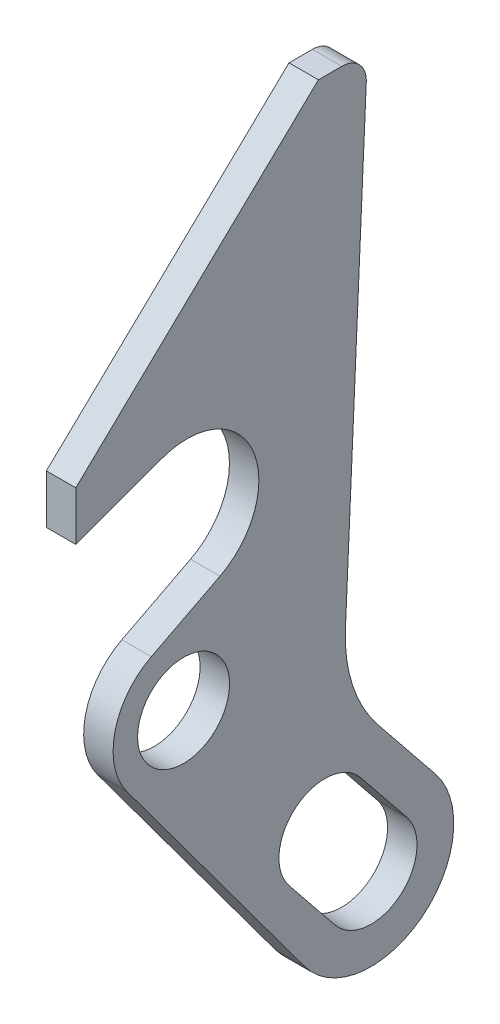
ISO-10303-21;
HEADER;
FILE_DESCRIPTION(('STEP AP214'),'2;1');
FILE_NAME('part.step','',(''),(''),'','','');
FILE_SCHEMA(('AUTOMOTIVE_DESIGN { 1 0 10303 214 1 1 1 1 }'));
ENDSEC;
DATA;
#1=APPLICATION_CONTEXT('core data for automotive mechanical design processes');
#2=APPLICATION_PROTOCOL_DEFINITION('international standard','automotive_design',2000,#1);
#3=PRODUCT_CONTEXT('',#1,'mechanical');
#4=PRODUCT('Part','Part','',(#3));
#5=PRODUCT_RELATED_PRODUCT_CATEGORY('part','',(#4));
#6=PRODUCT_DEFINITION_FORMATION('','',#4);
#7=PRODUCT_DEFINITION_CONTEXT('part definition',#1,'design');
#8=PRODUCT_DEFINITION('design','',#6,#7);
#9=PRODUCT_DEFINITION_SHAPE('','',#8);
#10=(LENGTH_UNIT() NAMED_UNIT(*) SI_UNIT(.MILLI.,.METRE.));
#11=(NAMED_UNIT(*) PLANE_ANGLE_UNIT() SI_UNIT($,.RADIAN.));
#12=(NAMED_UNIT(*) SI_UNIT($,.STERADIAN.) SOLID_ANGLE_UNIT());
#13=UNCERTAINTY_MEASURE_WITH_UNIT(LENGTH_MEASURE(1.E-05),#10,'distance_accuracy_value','');
#14=(GEOMETRIC_REPRESENTATION_CONTEXT(3) GLOBAL_UNCERTAINTY_ASSIGNED_CONTEXT((#13)) GLOBAL_UNIT_ASSIGNED_CONTEXT((#10,
#11,#12)) REPRESENTATION_CONTEXT('',''));
#15=CARTESIAN_POINT('',(0.,0.,0.));
#16=DIRECTION('',(0.,0.,1.));
#17=DIRECTION('',(1.,0.,0.));
#18=AXIS2_PLACEMENT_3D('',#15,#16,#17);
#19=CARTESIAN_POINT('',(0.762,14.351,-26.8605));
#20=DIRECTION('',(1.,0.,0.));
#21=DIRECTION('',(0.,0.,-1.));
#22=AXIS2_PLACEMENT_3D('',#19,#20,#21);
#23=PLANE('',#22);
#24=DIRECTION('',(0.,0.998988841273081,-0.0449588146181274));
#25=VECTOR('',#24,1.);
#26=CARTESIAN_POINT('',(0.762,51.2159352984177,-26.67550291));
#27=LINE('',#26,#25);
#28=CARTESIAN_POINT('',(0.762,25.8727756215487,-25.5349512134486));
#29=VERTEX_POINT('',#28);
#30=CARTESIAN_POINT('',(0.762,49.8888376038527,-26.6157777791827));
#31=VERTEX_POINT('',#30);
#32=EDGE_CURVE('E225',#29,#31,#27,.T.);
#33=ORIENTED_EDGE('',*,*,#32,.T.);
#34=CARTESIAN_POINT('',(0.762,49.9459352984177,-25.3470619507658));
#35=DIRECTION('',(1.,0.,0.));
#36=DIRECTION('',(0.,0.,-1.));
#37=AXIS2_PLACEMENT_3D('',#34,#35,#36);
#38=CIRCLE('',#37,1.27);
#39=CARTESIAN_POINT('',(0.762,51.2159352984177,-25.3470619507658));
#40=VERTEX_POINT('',#39);
#41=EDGE_CURVE('E11',#31,#40,#38,.T.);
#42=ORIENTED_EDGE('',*,*,#41,.T.);
#43=DIRECTION('',(0.,0.,1.));
#44=VECTOR('',#43,1.);
#45=CARTESIAN_POINT('',(0.762,51.2159352984177,-24.13550291));
#46=LINE('',#45,#44);
#47=CARTESIAN_POINT('',(0.762,51.2159352984177,-24.13550291));
#48=VERTEX_POINT('',#47);
#49=EDGE_CURVE('E227',#40,#48,#46,.T.);
#50=ORIENTED_EDGE('',*,*,#49,.T.);
#51=DIRECTION('',(0.,-0.691200695475951,0.722662852631545));
#52=VECTOR('',#51,1.);
#53=CARTESIAN_POINT('',(0.762,39.1950211982561,-11.5674193827116));
#54=LINE('',#53,#52);
#55=CARTESIAN_POINT('',(0.762,39.1950211982561,-11.5674193827116));
#56=VERTEX_POINT('',#55);
#57=EDGE_CURVE('E229',#48,#56,#54,.T.);
#58=ORIENTED_EDGE('',*,*,#57,.T.);
#59=DIRECTION('',(0.,-1.,0.));
#60=VECTOR('',#59,1.);
#61=CARTESIAN_POINT('',(0.762,36.6550211982561,-11.5674193827116));
#62=LINE('',#61,#60);
#63=CARTESIAN_POINT('',(0.762,36.6550211982561,-11.5674193827116));
#64=VERTEX_POINT('',#63);
#65=EDGE_CURVE('E206',#56,#64,#62,.T.);
#66=ORIENTED_EDGE('',*,*,#65,.T.);
#67=DIRECTION('',(0.,0.34202014332567,-0.939692620785908));
#68=VECTOR('',#67,1.);
#69=CARTESIAN_POINT('',(0.762,38.2918570609952,-16.064588954941));
#70=LINE('',#69,#68);
#71=CARTESIAN_POINT('',(0.762,38.2918570609952,-16.064588954941));
#72=VERTEX_POINT('',#71);
#73=EDGE_CURVE('E209',#64,#72,#70,.T.);
#74=ORIENTED_EDGE('',*,*,#73,.T.);
#75=CARTESIAN_POINT('',(0.762,34.80033299,-17.3353997890072));
#76=DIRECTION('',(-1.,0.,0.));
#77=DIRECTION('',(0.,0.,1.));
#78=AXIS2_PLACEMENT_3D('',#75,#76,#77);
#79=CIRCLE('',#78,3.71560230841777);
#80=CARTESIAN_POINT('',(0.762,31.4971965782703,-19.0368669088263));
#81=VERTEX_POINT('',#80);
#82=EDGE_CURVE('E212',#72,#81,#79,.T.);
#83=ORIENTED_EDGE('',*,*,#82,.T.);
#84=DIRECTION('',(0.,-0.457924981897103,0.888990838509901));
#85=VECTOR('',#84,1.);
#86=CARTESIAN_POINT('',(0.762,31.4971965782703,-19.0368669088263));
#87=LINE('',#86,#85);
#88=CARTESIAN_POINT('',(0.762,29.6642607891093,-15.4785043198482));
#89=VERTEX_POINT('',#88);
#90=EDGE_CURVE('E214',#81,#89,#87,.T.);
#91=ORIENTED_EDGE('',*,*,#90,.T.);
#92=CARTESIAN_POINT('',(0.762,26.41833299,-17.15050291));
#93=DIRECTION('',(1.,0.,0.));
#94=DIRECTION('',(0.,0.,-1.));
#95=AXIS2_PLACEMENT_3D('',#92,#93,#94);
#96=CIRCLE('',#95,3.65125);
#97=CARTESIAN_POINT('',(0.762,24.2479045598353,-14.2143716132027));
#98=VERTEX_POINT('',#97);
#99=EDGE_CURVE('E216',#89,#98,#96,.T.);
#100=ORIENTED_EDGE('',*,*,#99,.T.);
#101=DIRECTION('',(0.,-0.804144141539842,-0.594434352664069));
#102=VECTOR('',#101,1.);
#103=CARTESIAN_POINT('',(0.762,24.2479045598353,-14.2143716132027));
#104=LINE('',#103,#102);
#105=CARTESIAN_POINT('',(0.762,11.8031057558936,-23.4137371733248));
#106=VERTEX_POINT('',#105);
#107=EDGE_CURVE('E218',#98,#106,#104,.T.);
#108=ORIENTED_EDGE('',*,*,#107,.T.);
#109=CARTESIAN_POINT('',(0.762,14.351,-26.8605));
#110=DIRECTION('',(1.,0.,0.));
#111=DIRECTION('',(0.,0.,-1.));
#112=AXIS2_PLACEMENT_3D('',#109,#110,#111);
#113=CIRCLE('',#112,4.28625);
#114=CARTESIAN_POINT('',(0.762,17.0380598408734,-30.1999084018079));
#115=VERTEX_POINT('',#114);
#116=EDGE_CURVE('E220',#106,#115,#113,.T.);
#117=ORIENTED_EDGE('',*,*,#116,.T.);
#118=DIRECTION('',(0.,0.779097906516862,0.626902266753792));
#119=VECTOR('',#118,1.);
#120=CARTESIAN_POINT('',(0.762,17.0380598408734,-30.1999084018079));
#121=LINE('',#120,#119);
#122=CARTESIAN_POINT('',(0.762,20.7531941814947,-27.210520136291));
#123=VERTEX_POINT('',#122);
#124=EDGE_CURVE('E222',#115,#123,#121,.T.);
#125=ORIENTED_EDGE('',*,*,#124,.T.);
#126=CARTESIAN_POINT('',(0.762,25.5301894541586,-33.1472461839494));
#127=DIRECTION('',(1.,0.,0.));
#128=DIRECTION('',(0.,0.,-1.));
#129=AXIS2_PLACEMENT_3D('',#126,#127,#128);
#130=CIRCLE('',#129,7.62);
#131=EDGE_CURVE('E287',#123,#29,#130,.F.);
#132=ORIENTED_EDGE('',*,*,#131,.T.);
#133=EDGE_LOOP('',(#33,#42,#50,#58,#66,#74,#83,#91,#100,#108,#117,#125,#132));
#134=FACE_BOUND('',#133,.T.);
#135=CARTESIAN_POINT('',(0.762,26.41833299,-17.15050291));
#136=DIRECTION('',(1.,0.,0.));
#137=DIRECTION('',(0.,0.,-1.));
#138=AXIS2_PLACEMENT_3D('',#135,#136,#137);
#139=CIRCLE('',#138,2.38125);
#140=CARTESIAN_POINT('',(0.762,26.41833299,-14.76925291));
#141=VERTEX_POINT('',#140);
#142=EDGE_CURVE('E200',#141,#141,#139,.T.);
#143=ORIENTED_EDGE('',*,*,#142,.F.);
#144=EDGE_LOOP('',(#143));
#145=FACE_BOUND('',#144,.T.);
#146=DIRECTION('',(0.,0.77909790651686,0.626902266753795));
#147=VECTOR('',#146,1.);
#148=CARTESIAN_POINT('',(0.762,15.8438110227075,-28.7157268898933));
#149=LINE('',#148,#147);
#150=CARTESIAN_POINT('',(0.762,15.8438110227075,-28.7157268898933));
#151=VERTEX_POINT('',#150);
#152=CARTESIAN_POINT('',(0.762,18.8121740465367,-26.3272292535613));
#153=VERTEX_POINT('',#152);
#154=EDGE_CURVE('E169',#151,#153,#149,.T.);
#155=ORIENTED_EDGE('',*,*,#154,.F.);
#156=CARTESIAN_POINT('',(0.762,14.351,-26.8605));
#157=DIRECTION('',(1.,0.,0.));
#158=DIRECTION('',(0.,0.,-1.));
#159=AXIS2_PLACEMENT_3D('',#156,#157,#158);
#160=CIRCLE('',#159,2.38125);
#161=CARTESIAN_POINT('',(0.762,12.8581889772925,-25.0052731101067));
#162=VERTEX_POINT('',#161);
#163=EDGE_CURVE('E159',#162,#151,#160,.T.);
#164=ORIENTED_EDGE('',*,*,#163,.F.);
#165=DIRECTION('',(0.,-0.779097906516861,-0.626902266753794));
#166=VECTOR('',#165,1.);
#167=CARTESIAN_POINT('',(0.762,12.8581889772925,-25.0052731101067));
#168=LINE('',#167,#166);
#169=CARTESIAN_POINT('',(0.762,15.8265520011218,-22.6167754737748));
#170=VERTEX_POINT('',#169);
#171=EDGE_CURVE('E184',#170,#162,#168,.T.);
#172=ORIENTED_EDGE('',*,*,#171,.F.);
#173=CARTESIAN_POINT('',(0.762,17.3193630238292,-24.472002363668));
#174=DIRECTION('',(1.,0.,0.));
#175=DIRECTION('',(0.,0.,-1.));
#176=AXIS2_PLACEMENT_3D('',#173,#174,#175);
#177=CIRCLE('',#176,2.38125);
#178=EDGE_CURVE('E182',#153,#170,#177,.T.);
#179=ORIENTED_EDGE('',*,*,#178,.F.);
#180=EDGE_LOOP('',(#155,#164,#172,#179));
#181=FACE_BOUND('',#180,.T.);
#182=ADVANCED_FACE('F39',(#134,#145,#181),#23,.T.);
#183=CARTESIAN_POINT('',(-0.762,14.351,-26.8605));
#184=DIRECTION('',(1.,0.,0.));
#185=DIRECTION('',(0.,0.,-1.));
#186=AXIS2_PLACEMENT_3D('',#183,#184,#185);
#187=PLANE('',#186);
#188=CARTESIAN_POINT('',(-0.762,26.41833299,-17.15050291));
#189=DIRECTION('',(1.,0.,0.));
#190=DIRECTION('',(0.,0.,-1.));
#191=AXIS2_PLACEMENT_3D('',#188,#189,#190);
#192=CIRCLE('',#191,2.38125);
#193=CARTESIAN_POINT('',(-0.762,26.41833299,-14.76925291));
#194=VERTEX_POINT('',#193);
#195=EDGE_CURVE('E177',#194,#194,#192,.T.);
#196=ORIENTED_EDGE('',*,*,#195,.T.);
#197=EDGE_LOOP('',(#196));
#198=FACE_BOUND('',#197,.T.);
#199=DIRECTION('',(0.,0.,1.));
#200=VECTOR('',#199,1.);
#201=CARTESIAN_POINT('',(-0.762,51.2159352984177,-24.13550291));
#202=LINE('',#201,#200);
#203=CARTESIAN_POINT('',(-0.762,51.2159352984177,-25.3470619507658));
#204=VERTEX_POINT('',#203);
#205=CARTESIAN_POINT('',(-0.762,51.2159352984177,-24.13550291));
#206=VERTEX_POINT('',#205);
#207=EDGE_CURVE('E251',#204,#206,#202,.T.);
#208=ORIENTED_EDGE('',*,*,#207,.F.);
#209=CARTESIAN_POINT('',(-0.762,49.9459352984177,-25.3470619507658));
#210=DIRECTION('',(1.,0.,0.));
#211=DIRECTION('',(0.,0.,-1.));
#212=AXIS2_PLACEMENT_3D('',#209,#210,#211);
#213=CIRCLE('',#212,1.27);
#214=CARTESIAN_POINT('',(-0.762,49.8888376038527,-26.6157777791827));
#215=VERTEX_POINT('',#214);
#216=EDGE_CURVE('E61',#204,#215,#213,.F.);
#217=ORIENTED_EDGE('',*,*,#216,.T.);
#218=DIRECTION('',(0.,0.998988841273081,-0.0449588146181274));
#219=VECTOR('',#218,1.);
#220=CARTESIAN_POINT('',(-0.762,51.2159352984177,-26.67550291));
#221=LINE('',#220,#219);
#222=CARTESIAN_POINT('',(-0.762,25.8727756215487,-25.5349512134486));
#223=VERTEX_POINT('',#222);
#224=EDGE_CURVE('E249',#223,#215,#221,.T.);
#225=ORIENTED_EDGE('',*,*,#224,.F.);
#226=CARTESIAN_POINT('',(-0.762,25.5301894541586,-33.1472461839494));
#227=DIRECTION('',(1.,0.,0.));
#228=DIRECTION('',(0.,0.,-1.));
#229=AXIS2_PLACEMENT_3D('',#226,#227,#228);
#230=CIRCLE('',#229,7.62);
#231=CARTESIAN_POINT('',(-0.762,20.7531941814947,-27.210520136291));
#232=VERTEX_POINT('',#231);
#233=EDGE_CURVE('E285',#223,#232,#230,.T.);
#234=ORIENTED_EDGE('',*,*,#233,.T.);
#235=DIRECTION('',(0.,0.779097906516862,0.626902266753792));
#236=VECTOR('',#235,1.);
#237=CARTESIAN_POINT('',(-0.762,17.0380598408734,-30.1999084018079));
#238=LINE('',#237,#236);
#239=CARTESIAN_POINT('',(-0.762,17.0380598408734,-30.1999084018079));
#240=VERTEX_POINT('',#239);
#241=EDGE_CURVE('E246',#240,#232,#238,.T.);
#242=ORIENTED_EDGE('',*,*,#241,.F.);
#243=CARTESIAN_POINT('',(-0.762,14.351,-26.8605));
#244=DIRECTION('',(1.,0.,0.));
#245=DIRECTION('',(0.,0.,-1.));
#246=AXIS2_PLACEMENT_3D('',#243,#244,#245);
#247=CIRCLE('',#246,4.28625);
#248=CARTESIAN_POINT('',(-0.762,11.8031057558936,-23.4137371733248));
#249=VERTEX_POINT('',#248);
#250=EDGE_CURVE('E244',#249,#240,#247,.T.);
#251=ORIENTED_EDGE('',*,*,#250,.F.);
#252=DIRECTION('',(0.,-0.804144141539842,-0.594434352664069));
#253=VECTOR('',#252,1.);
#254=CARTESIAN_POINT('',(-0.762,24.2479045598353,-14.2143716132027));
#255=LINE('',#254,#253);
#256=CARTESIAN_POINT('',(-0.762,24.2479045598353,-14.2143716132027));
#257=VERTEX_POINT('',#256);
#258=EDGE_CURVE('E242',#257,#249,#255,.T.);
#259=ORIENTED_EDGE('',*,*,#258,.F.);
#260=CARTESIAN_POINT('',(-0.762,26.41833299,-17.15050291));
#261=DIRECTION('',(1.,0.,0.));
#262=DIRECTION('',(0.,0.,-1.));
#263=AXIS2_PLACEMENT_3D('',#260,#261,#262);
#264=CIRCLE('',#263,3.65125);
#265=CARTESIAN_POINT('',(-0.762,29.6642607891093,-15.4785043198482));
#266=VERTEX_POINT('',#265);
#267=EDGE_CURVE('E240',#266,#257,#264,.T.);
#268=ORIENTED_EDGE('',*,*,#267,.F.);
#269=DIRECTION('',(0.,-0.457924981897103,0.888990838509901));
#270=VECTOR('',#269,1.);
#271=CARTESIAN_POINT('',(-0.762,31.4971965782703,-19.0368669088263));
#272=LINE('',#271,#270);
#273=CARTESIAN_POINT('',(-0.762,31.4971965782703,-19.0368669088263));
#274=VERTEX_POINT('',#273);
#275=EDGE_CURVE('E238',#274,#266,#272,.T.);
#276=ORIENTED_EDGE('',*,*,#275,.F.);
#277=CARTESIAN_POINT('',(-0.762,34.80033299,-17.3353997890072));
#278=DIRECTION('',(-1.,0.,0.));
#279=DIRECTION('',(0.,0.,1.));
#280=AXIS2_PLACEMENT_3D('',#277,#278,#279);
#281=CIRCLE('',#280,3.71560230841777);
#282=CARTESIAN_POINT('',(-0.762,38.2918570609952,-16.064588954941));
#283=VERTEX_POINT('',#282);
#284=EDGE_CURVE('E236',#283,#274,#281,.T.);
#285=ORIENTED_EDGE('',*,*,#284,.F.);
#286=DIRECTION('',(0.,0.34202014332567,-0.939692620785908));
#287=VECTOR('',#286,1.);
#288=CARTESIAN_POINT('',(-0.762,38.2918570609952,-16.064588954941));
#289=LINE('',#288,#287);
#290=CARTESIAN_POINT('',(-0.762,36.6550211982561,-11.5674193827116));
#291=VERTEX_POINT('',#290);
#292=EDGE_CURVE('E234',#291,#283,#289,.T.);
#293=ORIENTED_EDGE('',*,*,#292,.F.);
#294=DIRECTION('',(0.,-1.,0.));
#295=VECTOR('',#294,1.);
#296=CARTESIAN_POINT('',(-0.762,36.6550211982561,-11.5674193827116));
#297=LINE('',#296,#295);
#298=CARTESIAN_POINT('',(-0.762,39.1950211982561,-11.5674193827116));
#299=VERTEX_POINT('',#298);
#300=EDGE_CURVE('E203',#299,#291,#297,.T.);
#301=ORIENTED_EDGE('',*,*,#300,.F.);
#302=DIRECTION('',(0.,-0.691200695475951,0.722662852631545));
#303=VECTOR('',#302,1.);
#304=CARTESIAN_POINT('',(-0.762,39.1950211982561,-11.5674193827116));
#305=LINE('',#304,#303);
#306=EDGE_CURVE('E210',#206,#299,#305,.T.);
#307=ORIENTED_EDGE('',*,*,#306,.F.);
#308=EDGE_LOOP('',(#208,#217,#225,#234,#242,#251,#259,#268,#276,#285,#293,#301,#307));
#309=FACE_BOUND('',#308,.T.);
#310=CARTESIAN_POINT('',(-0.762,14.351,-26.8605));
#311=DIRECTION('',(1.,0.,0.));
#312=DIRECTION('',(0.,0.,-1.));
#313=AXIS2_PLACEMENT_3D('',#310,#311,#312);
#314=CIRCLE('',#313,2.38125);
#315=CARTESIAN_POINT('',(-0.762,12.8581889772925,-25.0052731101067));
#316=VERTEX_POINT('',#315);
#317=CARTESIAN_POINT('',(-0.762,15.8438110227075,-28.7157268898933));
#318=VERTEX_POINT('',#317);
#319=EDGE_CURVE('E188',#316,#318,#314,.T.);
#320=ORIENTED_EDGE('',*,*,#319,.T.);
#321=DIRECTION('',(0.,0.77909790651686,0.626902266753795));
#322=VECTOR('',#321,1.);
#323=CARTESIAN_POINT('',(-0.762,15.8438110227075,-28.7157268898933));
#324=LINE('',#323,#322);
#325=CARTESIAN_POINT('',(-0.762,18.8121740465367,-26.3272292535613));
#326=VERTEX_POINT('',#325);
#327=EDGE_CURVE('E176',#318,#326,#324,.T.);
#328=ORIENTED_EDGE('',*,*,#327,.T.);
#329=CARTESIAN_POINT('',(-0.762,17.3193630238292,-24.472002363668));
#330=DIRECTION('',(1.,0.,0.));
#331=DIRECTION('',(0.,0.,-1.));
#332=AXIS2_PLACEMENT_3D('',#329,#330,#331);
#333=CIRCLE('',#332,2.38125);
#334=CARTESIAN_POINT('',(-0.762,15.8265520011218,-22.6167754737748));
#335=VERTEX_POINT('',#334);
#336=EDGE_CURVE('E191',#326,#335,#333,.T.);
#337=ORIENTED_EDGE('',*,*,#336,.T.);
#338=DIRECTION('',(0.,-0.779097906516861,-0.626902266753794));
#339=VECTOR('',#338,1.);
#340=CARTESIAN_POINT('',(-0.762,12.8581889772925,-25.0052731101067));
#341=LINE('',#340,#339);
#342=EDGE_CURVE('E170',#335,#316,#341,.T.);
#343=ORIENTED_EDGE('',*,*,#342,.T.);
#344=EDGE_LOOP('',(#320,#328,#337,#343));
#345=FACE_BOUND('',#344,.T.);
#346=ADVANCED_FACE('F300',(#198,#309,#345),#187,.F.);
#347=CARTESIAN_POINT('',(0.762,36.6550211982561,-11.5674193827116));
#348=DIRECTION('',(0.,0.,-1.));
#349=DIRECTION('',(0.,1.,0.));
#350=AXIS2_PLACEMENT_3D('',#347,#348,#349);
#351=PLANE('',#350);
#352=ORIENTED_EDGE('',*,*,#300,.T.);
#353=DIRECTION('',(-1.,0.,0.));
#354=VECTOR('',#353,1.);
#355=CARTESIAN_POINT('',(0.762,36.6550211982561,-11.5674193827116));
#356=LINE('',#355,#354);
#357=EDGE_CURVE('E277',#64,#291,#356,.T.);
#358=ORIENTED_EDGE('',*,*,#357,.F.);
#359=ORIENTED_EDGE('',*,*,#65,.F.);
#360=DIRECTION('',(-1.,0.,0.));
#361=VECTOR('',#360,1.);
#362=CARTESIAN_POINT('',(0.762,39.1950211982561,-11.5674193827116));
#363=LINE('',#362,#361);
#364=EDGE_CURVE('E231',#56,#299,#363,.T.);
#365=ORIENTED_EDGE('',*,*,#364,.T.);
#366=EDGE_LOOP('',(#352,#358,#359,#365));
#367=FACE_BOUND('',#366,.T.);
#368=ADVANCED_FACE('F309',(#367),#351,.F.);
#369=CARTESIAN_POINT('',(0.762,38.2918570609952,-16.064588954941));
#370=DIRECTION('',(0.,0.939692620785908,0.34202014332567));
#371=DIRECTION('',(0.,-0.34202014332567,0.939692620785908));
#372=AXIS2_PLACEMENT_3D('',#369,#370,#371);
#373=PLANE('',#372);
#374=ORIENTED_EDGE('',*,*,#292,.T.);
#375=DIRECTION('',(-1.,0.,0.));
#376=VECTOR('',#375,1.);
#377=CARTESIAN_POINT('',(0.762,38.2918570609952,-16.064588954941));
#378=LINE('',#377,#376);
#379=EDGE_CURVE('E274',#72,#283,#378,.T.);
#380=ORIENTED_EDGE('',*,*,#379,.F.);
#381=ORIENTED_EDGE('',*,*,#73,.F.);
#382=ORIENTED_EDGE('',*,*,#357,.T.);
#383=EDGE_LOOP('',(#374,#380,#381,#382));
#384=FACE_BOUND('',#383,.T.);
#385=ADVANCED_FACE('F362',(#384),#373,.F.);
#386=CARTESIAN_POINT('',(0.762,34.80033299,-17.3353997890072));
#387=DIRECTION('',(-1.,0.,0.));
#388=DIRECTION('',(0.,0.,1.));
#389=AXIS2_PLACEMENT_3D('',#386,#387,#388);
#390=CYLINDRICAL_SURFACE('',#389,3.71560230841777);
#391=ORIENTED_EDGE('',*,*,#284,.T.);
#392=DIRECTION('',(-1.,0.,0.));
#393=VECTOR('',#392,1.);
#394=CARTESIAN_POINT('',(0.762,31.4971965782703,-19.0368669088263));
#395=LINE('',#394,#393);
#396=EDGE_CURVE('E271',#81,#274,#395,.T.);
#397=ORIENTED_EDGE('',*,*,#396,.F.);
#398=ORIENTED_EDGE('',*,*,#82,.F.);
#399=ORIENTED_EDGE('',*,*,#379,.T.);
#400=EDGE_LOOP('',(#391,#397,#398,#399));
#401=FACE_BOUND('',#400,.T.);
#402=ADVANCED_FACE('F358',(#401),#390,.F.);
#403=CARTESIAN_POINT('',(0.762,31.4971965782703,-19.0368669088263));
#404=DIRECTION('',(0.,-0.888990838509901,-0.457924981897103));
#405=DIRECTION('',(0.,0.457924981897103,-0.888990838509901));
#406=AXIS2_PLACEMENT_3D('',#403,#404,#405);
#407=PLANE('',#406);
#408=ORIENTED_EDGE('',*,*,#275,.T.);
#409=DIRECTION('',(-1.,0.,0.));
#410=VECTOR('',#409,1.);
#411=CARTESIAN_POINT('',(0.762,29.6642607891093,-15.4785043198482));
#412=LINE('',#411,#410);
#413=EDGE_CURVE('E268',#89,#266,#412,.T.);
#414=ORIENTED_EDGE('',*,*,#413,.F.);
#415=ORIENTED_EDGE('',*,*,#90,.F.);
#416=ORIENTED_EDGE('',*,*,#396,.T.);
#417=EDGE_LOOP('',(#408,#414,#415,#416));
#418=FACE_BOUND('',#417,.T.);
#419=ADVANCED_FACE('F354',(#418),#407,.F.);
#420=CARTESIAN_POINT('',(0.762,26.41833299,-17.15050291));
#421=DIRECTION('',(-1.,0.,0.));
#422=DIRECTION('',(0.,0.,1.));
#423=AXIS2_PLACEMENT_3D('',#420,#421,#422);
#424=CYLINDRICAL_SURFACE('',#423,3.65125);
#425=ORIENTED_EDGE('',*,*,#267,.T.);
#426=DIRECTION('',(-1.,0.,0.));
#427=VECTOR('',#426,1.);
#428=CARTESIAN_POINT('',(0.762,24.2479045598353,-14.2143716132027));
#429=LINE('',#428,#427);
#430=EDGE_CURVE('E265',#98,#257,#429,.T.);
#431=ORIENTED_EDGE('',*,*,#430,.F.);
#432=ORIENTED_EDGE('',*,*,#99,.F.);
#433=ORIENTED_EDGE('',*,*,#413,.T.);
#434=EDGE_LOOP('',(#425,#431,#432,#433));
#435=FACE_BOUND('',#434,.T.);
#436=ADVANCED_FACE('F350',(#435),#424,.T.);
#437=CARTESIAN_POINT('',(0.762,24.2479045598353,-14.2143716132027));
#438=DIRECTION('',(0.,0.594434352664069,-0.804144141539842));
#439=DIRECTION('',(0.,0.804144141539842,0.594434352664069));
#440=AXIS2_PLACEMENT_3D('',#437,#438,#439);
#441=PLANE('',#440);
#442=ORIENTED_EDGE('',*,*,#258,.T.);
#443=DIRECTION('',(-1.,0.,0.));
#444=VECTOR('',#443,1.);
#445=CARTESIAN_POINT('',(0.762,11.8031057558936,-23.4137371733248));
#446=LINE('',#445,#444);
#447=EDGE_CURVE('E262',#106,#249,#446,.T.);
#448=ORIENTED_EDGE('',*,*,#447,.F.);
#449=ORIENTED_EDGE('',*,*,#107,.F.);
#450=ORIENTED_EDGE('',*,*,#430,.T.);
#451=EDGE_LOOP('',(#442,#448,#449,#450));
#452=FACE_BOUND('',#451,.T.);
#453=ADVANCED_FACE('F346',(#452),#441,.F.);
#454=CARTESIAN_POINT('',(0.762,14.351,-26.8605));
#455=DIRECTION('',(-1.,0.,0.));
#456=DIRECTION('',(0.,0.,1.));
#457=AXIS2_PLACEMENT_3D('',#454,#455,#456);
#458=CYLINDRICAL_SURFACE('',#457,4.28625);
#459=ORIENTED_EDGE('',*,*,#250,.T.);
#460=DIRECTION('',(-1.,0.,0.));
#461=VECTOR('',#460,1.);
#462=CARTESIAN_POINT('',(0.762,17.0380598408734,-30.1999084018079));
#463=LINE('',#462,#461);
#464=EDGE_CURVE('E259',#115,#240,#463,.T.);
#465=ORIENTED_EDGE('',*,*,#464,.F.);
#466=ORIENTED_EDGE('',*,*,#116,.F.);
#467=ORIENTED_EDGE('',*,*,#447,.T.);
#468=EDGE_LOOP('',(#459,#465,#466,#467));
#469=FACE_BOUND('',#468,.T.);
#470=ADVANCED_FACE('F342',(#469),#458,.T.);
#471=CARTESIAN_POINT('',(0.762,17.0380598408734,-30.1999084018079));
#472=DIRECTION('',(0.,-0.626902266753792,0.779097906516862));
#473=DIRECTION('',(0.,-0.779097906516862,-0.626902266753792));
#474=AXIS2_PLACEMENT_3D('',#471,#472,#473);
#475=PLANE('',#474);
#476=ORIENTED_EDGE('',*,*,#241,.T.);
#477=DIRECTION('',(-1.,0.,0.));
#478=VECTOR('',#477,1.);
#479=CARTESIAN_POINT('',(0.762,20.7531941814947,-27.210520136291));
#480=LINE('',#479,#478);
#481=EDGE_CURVE('E283',#232,#123,#480,.F.);
#482=ORIENTED_EDGE('',*,*,#481,.T.);
#483=ORIENTED_EDGE('',*,*,#124,.F.);
#484=ORIENTED_EDGE('',*,*,#464,.T.);
#485=EDGE_LOOP('',(#476,#482,#483,#484));
#486=FACE_BOUND('',#485,.T.);
#487=ADVANCED_FACE('F339',(#486),#475,.F.);
#488=CARTESIAN_POINT('',(0.762,51.2159352984177,-26.67550291));
#489=DIRECTION('',(0.,0.0449588146181274,0.998988841273081));
#490=DIRECTION('',(0.,-0.998988841273081,0.0449588146181274));
#491=AXIS2_PLACEMENT_3D('',#488,#489,#490);
#492=PLANE('',#491);
#493=ORIENTED_EDGE('',*,*,#224,.T.);
#494=DIRECTION('',(-1.,0.,0.));
#495=VECTOR('',#494,1.);
#496=CARTESIAN_POINT('',(0.762,49.8888376038527,-26.6157777791827));
#497=LINE('',#496,#495);
#498=EDGE_CURVE('E47',#215,#31,#497,.F.);
#499=ORIENTED_EDGE('',*,*,#498,.T.);
#500=ORIENTED_EDGE('',*,*,#32,.F.);
#501=DIRECTION('',(-1.,0.,0.));
#502=VECTOR('',#501,1.);
#503=CARTESIAN_POINT('',(-0.762,25.8727756215487,-25.5349512134486));
#504=LINE('',#503,#502);
#505=EDGE_CURVE('E280',#29,#223,#504,.T.);
#506=ORIENTED_EDGE('',*,*,#505,.T.);
#507=EDGE_LOOP('',(#493,#499,#500,#506));
#508=FACE_BOUND('',#507,.T.);
#509=ADVANCED_FACE('F336',(#508),#492,.F.);
#510=CARTESIAN_POINT('',(0.762,51.2159352984177,-24.13550291));
#511=DIRECTION('',(0.,-1.,0.));
#512=DIRECTION('',(0.,0.,-1.));
#513=AXIS2_PLACEMENT_3D('',#510,#511,#512);
#514=PLANE('',#513);
#515=ORIENTED_EDGE('',*,*,#49,.F.);
#516=DIRECTION('',(-1.,0.,0.));
#517=VECTOR('',#516,1.);
#518=CARTESIAN_POINT('',(0.762,51.2159352984177,-25.3470619507658));
#519=LINE('',#518,#517);
#520=EDGE_CURVE('E289',#40,#204,#519,.T.);
#521=ORIENTED_EDGE('',*,*,#520,.T.);
#522=ORIENTED_EDGE('',*,*,#207,.T.);
#523=DIRECTION('',(-1.,0.,0.));
#524=VECTOR('',#523,1.);
#525=CARTESIAN_POINT('',(0.762,51.2159352984177,-24.13550291));
#526=LINE('',#525,#524);
#527=EDGE_CURVE('E256',#48,#206,#526,.T.);
#528=ORIENTED_EDGE('',*,*,#527,.F.);
#529=EDGE_LOOP('',(#515,#521,#522,#528));
#530=FACE_BOUND('',#529,.T.);
#531=ADVANCED_FACE('F295',(#530),#514,.F.);
#532=CARTESIAN_POINT('',(0.762,39.1950211982561,-11.5674193827116));
#533=DIRECTION('',(0.,-0.722662852631544,-0.691200695475951));
#534=DIRECTION('',(0.,0.691200695475951,-0.722662852631545));
#535=AXIS2_PLACEMENT_3D('',#532,#533,#534);
#536=PLANE('',#535);
#537=ORIENTED_EDGE('',*,*,#306,.T.);
#538=ORIENTED_EDGE('',*,*,#364,.F.);
#539=ORIENTED_EDGE('',*,*,#57,.F.);
#540=ORIENTED_EDGE('',*,*,#527,.T.);
#541=EDGE_LOOP('',(#537,#538,#539,#540));
#542=FACE_BOUND('',#541,.T.);
#543=ADVANCED_FACE('F305',(#542),#536,.F.);
#544=CARTESIAN_POINT('',(0.762,26.41833299,-17.15050291));
#545=DIRECTION('',(-1.,0.,0.));
#546=DIRECTION('',(0.,0.,1.));
#547=AXIS2_PLACEMENT_3D('',#544,#545,#546);
#548=CYLINDRICAL_SURFACE('',#547,2.38125);
#549=CARTESIAN_POINT('',(0.762,26.41833299,-14.76925291));
#550=CARTESIAN_POINT('',(0.746125,26.41833299,-14.76925291));
#551=CARTESIAN_POINT('',(0.73025,26.41833299,-14.76925291));
#552=CARTESIAN_POINT('',(0.6985,26.41833299,-14.76925291));
#553=CARTESIAN_POINT('',(0.682625,26.41833299,-14.76925291));
#554=CARTESIAN_POINT('',(0.650875,26.41833299,-14.76925291));
#555=CARTESIAN_POINT('',(0.635,26.41833299,-14.76925291));
#556=CARTESIAN_POINT('',(0.60325,26.41833299,-14.76925291));
#557=CARTESIAN_POINT('',(0.587375,26.41833299,-14.76925291));
#558=CARTESIAN_POINT('',(0.555625,26.41833299,-14.76925291));
#559=CARTESIAN_POINT('',(0.53975,26.41833299,-14.76925291));
#560=CARTESIAN_POINT('',(0.508,26.41833299,-14.76925291));
#561=CARTESIAN_POINT('',(0.492125,26.41833299,-14.76925291));
#562=CARTESIAN_POINT('',(0.460375,26.41833299,-14.76925291));
#563=CARTESIAN_POINT('',(0.4445,26.41833299,-14.76925291));
#564=CARTESIAN_POINT('',(0.41275,26.41833299,-14.76925291));
#565=CARTESIAN_POINT('',(0.396875,26.41833299,-14.76925291));
#566=CARTESIAN_POINT('',(0.365125,26.41833299,-14.76925291));
#567=CARTESIAN_POINT('',(0.34925,26.41833299,-14.76925291));
#568=CARTESIAN_POINT('',(0.3175,26.41833299,-14.76925291));
#569=CARTESIAN_POINT('',(0.301625,26.41833299,-14.76925291));
#570=CARTESIAN_POINT('',(0.269875,26.41833299,-14.76925291));
#571=CARTESIAN_POINT('',(0.254,26.41833299,-14.76925291));
#572=CARTESIAN_POINT('',(0.22225,26.41833299,-14.76925291));
#573=CARTESIAN_POINT('',(0.206375,26.41833299,-14.76925291));
#574=CARTESIAN_POINT('',(0.174625,26.41833299,-14.76925291));
#575=CARTESIAN_POINT('',(0.15875,26.41833299,-14.76925291));
#576=CARTESIAN_POINT('',(0.127,26.41833299,-14.76925291));
#577=CARTESIAN_POINT('',(0.111125,26.41833299,-14.76925291));
#578=CARTESIAN_POINT('',(0.0793749999999999,26.41833299,-14.76925291));
#579=CARTESIAN_POINT('',(0.0634999999999999,26.41833299,-14.76925291));
#580=CARTESIAN_POINT('',(0.0317499999999999,26.41833299,-14.76925291));
#581=CARTESIAN_POINT('',(0.0158749999999999,26.41833299,-14.76925291));
#582=CARTESIAN_POINT('',(-0.0158750000000001,26.41833299,-14.76925291));
#583=CARTESIAN_POINT('',(-0.0317500000000001,26.41833299,-14.76925291));
#584=CARTESIAN_POINT('',(-0.0635000000000002,26.41833299,-14.76925291));
#585=CARTESIAN_POINT('',(-0.0793750000000002,26.41833299,-14.76925291));
#586=CARTESIAN_POINT('',(-0.111125,26.41833299,-14.76925291));
#587=CARTESIAN_POINT('',(-0.127,26.41833299,-14.76925291));
#588=CARTESIAN_POINT('',(-0.15875,26.41833299,-14.76925291));
#589=CARTESIAN_POINT('',(-0.174625,26.41833299,-14.76925291));
#590=CARTESIAN_POINT('',(-0.206375,26.41833299,-14.76925291));
#591=CARTESIAN_POINT('',(-0.22225,26.41833299,-14.76925291));
#592=CARTESIAN_POINT('',(-0.254,26.41833299,-14.76925291));
#593=CARTESIAN_POINT('',(-0.269875,26.41833299,-14.76925291));
#594=CARTESIAN_POINT('',(-0.301625,26.41833299,-14.76925291));
#595=CARTESIAN_POINT('',(-0.3175,26.41833299,-14.76925291));
#596=CARTESIAN_POINT('',(-0.34925,26.41833299,-14.76925291));
#597=CARTESIAN_POINT('',(-0.365125,26.41833299,-14.76925291));
#598=CARTESIAN_POINT('',(-0.396875,26.41833299,-14.76925291));
#599=CARTESIAN_POINT('',(-0.41275,26.41833299,-14.76925291));
#600=CARTESIAN_POINT('',(-0.4445,26.41833299,-14.76925291));
#601=CARTESIAN_POINT('',(-0.460375,26.41833299,-14.76925291));
#602=CARTESIAN_POINT('',(-0.492125,26.41833299,-14.76925291));
#603=CARTESIAN_POINT('',(-0.508,26.41833299,-14.76925291));
#604=CARTESIAN_POINT('',(-0.53975,26.41833299,-14.76925291));
#605=CARTESIAN_POINT('',(-0.555625,26.41833299,-14.76925291));
#606=CARTESIAN_POINT('',(-0.587375,26.41833299,-14.76925291));
#607=CARTESIAN_POINT('',(-0.60325,26.41833299,-14.76925291));
#608=CARTESIAN_POINT('',(-0.635,26.41833299,-14.76925291));
#609=CARTESIAN_POINT('',(-0.650875,26.41833299,-14.76925291));
#610=CARTESIAN_POINT('',(-0.682625,26.41833299,-14.76925291));
#611=CARTESIAN_POINT('',(-0.6985,26.41833299,-14.76925291));
#612=CARTESIAN_POINT('',(-0.73025,26.41833299,-14.76925291));
#613=CARTESIAN_POINT('',(-0.746125,26.41833299,-14.76925291));
#614=CARTESIAN_POINT('',(-0.762,26.41833299,-14.76925291));
#615=B_SPLINE_CURVE_WITH_KNOTS('',3,(#549,#550,#551,#552,#553,#554,#555,#556,#557,#558,#559,
#560,#561,#562,#563,#564,#565,#566,#567,#568,#569,#570,#571,#572,#573,#574,#575,#576,#577,#578,
#579,#580,#581,#582,#583,#584,#585,#586,#587,#588,#589,#590,#591,#592,#593,#594,#595,#596,#597,
#598,#599,#600,#601,#602,#603,#604,#605,#606,#607,#608,#609,#610,#611,#612,#613,#614),
.UNSPECIFIED.,.F.,.F.,(4,2,2,2,2,2,2,2,2,2,2,2,2,2,2,2,2,2,2,2,2,2,2,2,2,2,2,2,2,2,2,2,4),(0.,
0.0476249999999999,0.09525,0.142875,0.1905,0.238125,0.28575,0.333375,0.381,0.428625,0.47625,
0.523875,0.5715,0.619125,0.66675,0.714375,0.762,0.809625,0.85725,0.904875,0.9525,1.000125,
1.04775,1.095375,1.143,1.190625,1.23825,1.285875,1.3335,1.381125,1.42875,1.476375,1.524),.UNSPECIFIED.);
#616=EDGE_CURVE('BSEAM329',#141,#194,#615,.T.);
#617=ORIENTED_EDGE('',*,*,#142,.T.);
#618=ORIENTED_EDGE('',*,*,#195,.F.);
#619=ORIENTED_EDGE('',*,*,#616,.T.);
#620=ORIENTED_EDGE('',*,*,#616,.F.);
#621=EDGE_LOOP('',(#617,#619,#618,#620));
#622=FACE_BOUND('',#621,.T.);
#623=ADVANCED_FACE('F329',(#622),#548,.F.);
#624=CARTESIAN_POINT('',(0.762,14.351,-26.8605));
#625=DIRECTION('',(-1.,0.,0.));
#626=DIRECTION('',(0.,0.,1.));
#627=AXIS2_PLACEMENT_3D('',#624,#625,#626);
#628=CYLINDRICAL_SURFACE('',#627,2.38125);
#629=ORIENTED_EDGE('',*,*,#319,.F.);
#630=DIRECTION('',(-1.,0.,0.));
#631=VECTOR('',#630,1.);
#632=CARTESIAN_POINT('',(0.762,12.8581889772925,-25.0052731101067));
#633=LINE('',#632,#631);
#634=EDGE_CURVE('E165',#162,#316,#633,.T.);
#635=ORIENTED_EDGE('',*,*,#634,.F.);
#636=ORIENTED_EDGE('',*,*,#163,.T.);
#637=DIRECTION('',(-1.,0.,0.));
#638=VECTOR('',#637,1.);
#639=CARTESIAN_POINT('',(0.762,15.8438110227075,-28.7157268898933));
#640=LINE('',#639,#638);
#641=EDGE_CURVE('E162',#151,#318,#640,.T.);
#642=ORIENTED_EDGE('',*,*,#641,.T.);
#643=EDGE_LOOP('',(#629,#635,#636,#642));
#644=FACE_BOUND('',#643,.T.);
#645=ADVANCED_FACE('F161',(#644),#628,.F.);
#646=CARTESIAN_POINT('',(0.762,15.8438110227075,-28.7157268898933));
#647=DIRECTION('',(0.,-0.626902266753795,0.77909790651686));
#648=DIRECTION('',(0.,-0.77909790651686,-0.626902266753795));
#649=AXIS2_PLACEMENT_3D('',#646,#647,#648);
#650=PLANE('',#649);
#651=ORIENTED_EDGE('',*,*,#327,.F.);
#652=ORIENTED_EDGE('',*,*,#641,.F.);
#653=ORIENTED_EDGE('',*,*,#154,.T.);
#654=DIRECTION('',(-1.,0.,0.));
#655=VECTOR('',#654,1.);
#656=CARTESIAN_POINT('',(0.762,18.8121740465367,-26.3272292535613));
#657=LINE('',#656,#655);
#658=EDGE_CURVE('E178',#153,#326,#657,.T.);
#659=ORIENTED_EDGE('',*,*,#658,.T.);
#660=EDGE_LOOP('',(#651,#652,#653,#659));
#661=FACE_BOUND('',#660,.T.);
#662=ADVANCED_FACE('F173',(#661),#650,.T.);
#663=CARTESIAN_POINT('',(0.762,17.3193630238292,-24.472002363668));
#664=DIRECTION('',(-1.,0.,0.));
#665=DIRECTION('',(0.,0.,1.));
#666=AXIS2_PLACEMENT_3D('',#663,#664,#665);
#667=CYLINDRICAL_SURFACE('',#666,2.38125);
#668=ORIENTED_EDGE('',*,*,#336,.F.);
#669=ORIENTED_EDGE('',*,*,#658,.F.);
#670=ORIENTED_EDGE('',*,*,#178,.T.);
#671=DIRECTION('',(-1.,0.,0.));
#672=VECTOR('',#671,1.);
#673=CARTESIAN_POINT('',(0.762,15.8265520011218,-22.6167754737748));
#674=LINE('',#673,#672);
#675=EDGE_CURVE('E197',#170,#335,#674,.T.);
#676=ORIENTED_EDGE('',*,*,#675,.T.);
#677=EDGE_LOOP('',(#668,#669,#670,#676));
#678=FACE_BOUND('',#677,.T.);
#679=ADVANCED_FACE('F431',(#678),#667,.F.);
#680=CARTESIAN_POINT('',(0.762,12.8581889772925,-25.0052731101067));
#681=DIRECTION('',(0.,0.626902266753794,-0.779097906516861));
#682=DIRECTION('',(0.,0.779097906516861,0.626902266753794));
#683=AXIS2_PLACEMENT_3D('',#680,#681,#682);
#684=PLANE('',#683);
#685=ORIENTED_EDGE('',*,*,#342,.F.);
#686=ORIENTED_EDGE('',*,*,#675,.F.);
#687=ORIENTED_EDGE('',*,*,#171,.T.);
#688=ORIENTED_EDGE('',*,*,#634,.T.);
#689=EDGE_LOOP('',(#685,#686,#687,#688));
#690=FACE_BOUND('',#689,.T.);
#691=ADVANCED_FACE('F319',(#690),#684,.T.);
#692=CARTESIAN_POINT('',(0.762,25.5301894541586,-33.1472461839494));
#693=DIRECTION('',(1.,0.,0.));
#694=DIRECTION('',(0.,0.,-1.));
#695=AXIS2_PLACEMENT_3D('',#692,#693,#694);
#696=CYLINDRICAL_SURFACE('',#695,7.62);
#697=ORIENTED_EDGE('',*,*,#131,.F.);
#698=ORIENTED_EDGE('',*,*,#481,.F.);
#699=ORIENTED_EDGE('',*,*,#233,.F.);
#700=ORIENTED_EDGE('',*,*,#505,.F.);
#701=EDGE_LOOP('',(#697,#698,#699,#700));
#702=FACE_BOUND('',#701,.T.);
#703=ADVANCED_FACE('F315',(#702),#696,.F.);
#704=CARTESIAN_POINT('',(0.762,49.9459352984177,-25.3470619507658));
#705=DIRECTION('',(-1.,0.,0.));
#706=DIRECTION('',(0.,0.,1.));
#707=AXIS2_PLACEMENT_3D('',#704,#705,#706);
#708=CYLINDRICAL_SURFACE('',#707,1.27);
#709=ORIENTED_EDGE('',*,*,#41,.F.);
#710=ORIENTED_EDGE('',*,*,#498,.F.);
#711=ORIENTED_EDGE('',*,*,#216,.F.);
#712=ORIENTED_EDGE('',*,*,#520,.F.);
#713=EDGE_LOOP('',(#709,#710,#711,#712));
#714=FACE_BOUND('',#713,.T.);
#715=ADVANCED_FACE('F41',(#714),#708,.T.);
#716=CLOSED_SHELL('',(#182,#346,#368,#385,#402,#419,#436,#453,#470,#487,#509,#531,#543,#623,
#645,#662,#679,#691,#703,#715));
#717=MANIFOLD_SOLID_BREP('B2',#716);
#718=ADVANCED_BREP_SHAPE_REPRESENTATION('',(#18,#717),#14);
#719=SHAPE_DEFINITION_REPRESENTATION(#9,#718);
ENDSEC;
END-ISO-10303-21;
